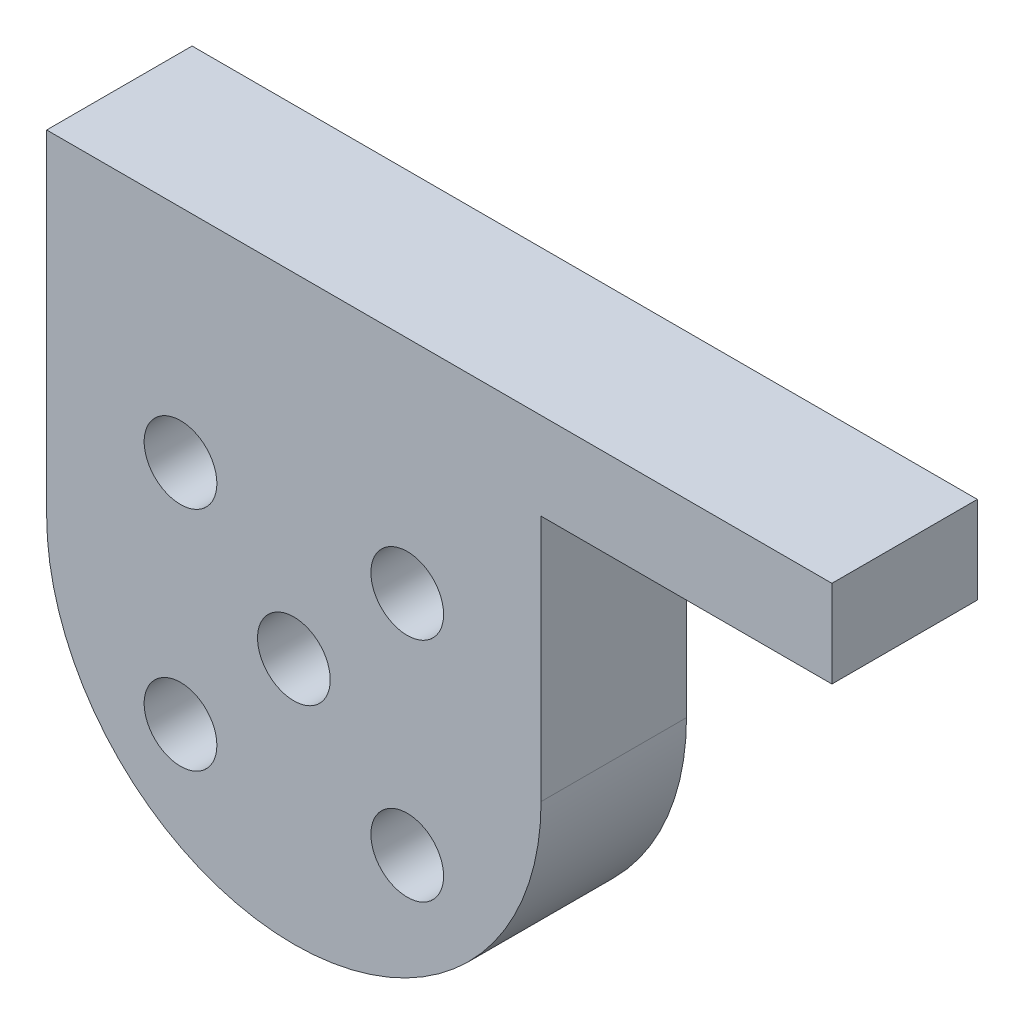
ISO-10303-21;
HEADER;
FILE_DESCRIPTION(('STEP AP214'),'2;1');
FILE_NAME('part.step','',(''),(''),'','','');
FILE_SCHEMA(('AUTOMOTIVE_DESIGN { 1 0 10303 214 1 1 1 1 }'));
ENDSEC;
DATA;
#1=APPLICATION_CONTEXT('core data for automotive mechanical design processes');
#2=APPLICATION_PROTOCOL_DEFINITION('international standard','automotive_design',2000,#1);
#3=PRODUCT_CONTEXT('',#1,'mechanical');
#4=PRODUCT('Part','Part','',(#3));
#5=PRODUCT_RELATED_PRODUCT_CATEGORY('part','',(#4));
#6=PRODUCT_DEFINITION_FORMATION('','',#4);
#7=PRODUCT_DEFINITION_CONTEXT('part definition',#1,'design');
#8=PRODUCT_DEFINITION('design','',#6,#7);
#9=PRODUCT_DEFINITION_SHAPE('','',#8);
#10=(LENGTH_UNIT() NAMED_UNIT(*) SI_UNIT(.MILLI.,.METRE.));
#11=(NAMED_UNIT(*) PLANE_ANGLE_UNIT() SI_UNIT($,.RADIAN.));
#12=(NAMED_UNIT(*) SI_UNIT($,.STERADIAN.) SOLID_ANGLE_UNIT());
#13=UNCERTAINTY_MEASURE_WITH_UNIT(LENGTH_MEASURE(1.E-05),#10,'distance_accuracy_value','');
#14=(GEOMETRIC_REPRESENTATION_CONTEXT(3) GLOBAL_UNCERTAINTY_ASSIGNED_CONTEXT((#13)) GLOBAL_UNIT_ASSIGNED_CONTEXT((#10,
#11,#12)) REPRESENTATION_CONTEXT('',''));
#15=CARTESIAN_POINT('',(0.,0.,0.));
#16=DIRECTION('',(0.,0.,1.));
#17=DIRECTION('',(1.,0.,0.));
#18=AXIS2_PLACEMENT_3D('',#15,#16,#17);
#19=CARTESIAN_POINT('',(0.,0.,6.35));
#20=DIRECTION('',(0.,0.,1.));
#21=DIRECTION('',(1.,0.,0.));
#22=AXIS2_PLACEMENT_3D('',#19,#20,#21);
#23=PLANE('',#22);
#24=CARTESIAN_POINT('',(4.95000000000002,-4.95,6.35));
#25=DIRECTION('',(0.,0.,1.));
#26=DIRECTION('',(1.,0.,0.));
#27=AXIS2_PLACEMENT_3D('',#24,#25,#26);
#28=CIRCLE('',#27,1.58749999999999);
#29=CARTESIAN_POINT('',(6.53750000000001,-4.95,6.35));
#30=VERTEX_POINT('',#29);
#31=EDGE_CURVE('E220',#30,#30,#28,.T.);
#32=ORIENTED_EDGE('',*,*,#31,.F.);
#33=EDGE_LOOP('',(#32));
#34=FACE_BOUND('',#33,.T.);
#35=CARTESIAN_POINT('',(-4.94999999999998,4.95000000000002,6.35));
#36=DIRECTION('',(0.,0.,1.));
#37=DIRECTION('',(1.,0.,0.));
#38=AXIS2_PLACEMENT_3D('',#35,#36,#37);
#39=CIRCLE('',#38,1.5875);
#40=CARTESIAN_POINT('',(-3.36249999999998,4.95000000000002,6.35));
#41=VERTEX_POINT('',#40);
#42=EDGE_CURVE('E236',#41,#41,#39,.T.);
#43=ORIENTED_EDGE('',*,*,#42,.F.);
#44=EDGE_LOOP('',(#43));
#45=FACE_BOUND('',#44,.T.);
#46=CARTESIAN_POINT('',(0.,0.,6.35));
#47=DIRECTION('',(0.,0.,1.));
#48=DIRECTION('',(1.,0.,0.));
#49=AXIS2_PLACEMENT_3D('',#46,#47,#48);
#50=CIRCLE('',#49,10.795);
#51=CARTESIAN_POINT('',(-10.795,0.,6.35));
#52=VERTEX_POINT('',#51);
#53=CARTESIAN_POINT('',(10.795,0.,6.35));
#54=VERTEX_POINT('',#53);
#55=EDGE_CURVE('E150',#52,#54,#50,.T.);
#56=ORIENTED_EDGE('',*,*,#55,.T.);
#57=DIRECTION('',(0.,1.,0.));
#58=VECTOR('',#57,1.);
#59=CARTESIAN_POINT('',(10.795,0.,6.35));
#60=LINE('',#59,#58);
#61=CARTESIAN_POINT('',(10.795,10.795,6.35));
#62=VERTEX_POINT('',#61);
#63=EDGE_CURVE('E98',#54,#62,#60,.T.);
#64=ORIENTED_EDGE('',*,*,#63,.T.);
#65=DIRECTION('',(1.,0.,0.));
#66=VECTOR('',#65,1.);
#67=CARTESIAN_POINT('',(10.795,10.795,6.35));
#68=LINE('',#67,#66);
#69=CARTESIAN_POINT('',(23.495,10.795,6.35));
#70=VERTEX_POINT('',#69);
#71=EDGE_CURVE('E111',#62,#70,#68,.T.);
#72=ORIENTED_EDGE('',*,*,#71,.T.);
#73=DIRECTION('',(0.,1.,0.));
#74=VECTOR('',#73,1.);
#75=CARTESIAN_POINT('',(23.495,10.795,6.35));
#76=LINE('',#75,#74);
#77=CARTESIAN_POINT('',(23.495,14.605,6.35));
#78=VERTEX_POINT('',#77);
#79=EDGE_CURVE('E105',#70,#78,#76,.T.);
#80=ORIENTED_EDGE('',*,*,#79,.T.);
#81=DIRECTION('',(-1.,0.,0.));
#82=VECTOR('',#81,1.);
#83=CARTESIAN_POINT('',(23.495,14.605,6.35));
#84=LINE('',#83,#82);
#85=CARTESIAN_POINT('',(-10.795,14.605,6.35));
#86=VERTEX_POINT('',#85);
#87=EDGE_CURVE('E109',#78,#86,#84,.T.);
#88=ORIENTED_EDGE('',*,*,#87,.T.);
#89=DIRECTION('',(0.,-1.,0.));
#90=VECTOR('',#89,1.);
#91=CARTESIAN_POINT('',(-10.795,14.605,6.35));
#92=LINE('',#91,#90);
#93=EDGE_CURVE('E61',#86,#52,#92,.T.);
#94=ORIENTED_EDGE('',*,*,#93,.T.);
#95=EDGE_LOOP('',(#56,#64,#72,#80,#88,#94));
#96=FACE_BOUND('',#95,.T.);
#97=CARTESIAN_POINT('',(0.,0.,6.35));
#98=DIRECTION('',(0.,0.,1.));
#99=DIRECTION('',(1.,0.,0.));
#100=AXIS2_PLACEMENT_3D('',#97,#98,#99);
#101=CIRCLE('',#100,1.5875);
#102=CARTESIAN_POINT('',(1.58750000000006,0.,6.35));
#103=VERTEX_POINT('',#102);
#104=EDGE_CURVE('E138',#103,#103,#101,.T.);
#105=ORIENTED_EDGE('',*,*,#104,.F.);
#106=EDGE_LOOP('',(#105));
#107=FACE_BOUND('',#106,.T.);
#108=CARTESIAN_POINT('',(-4.94999999999998,-4.95,6.35));
#109=DIRECTION('',(0.,0.,1.));
#110=DIRECTION('',(1.,0.,0.));
#111=AXIS2_PLACEMENT_3D('',#108,#109,#110);
#112=CIRCLE('',#111,1.5875);
#113=CARTESIAN_POINT('',(-3.36249999999998,-4.95,6.35));
#114=VERTEX_POINT('',#113);
#115=EDGE_CURVE('E228',#114,#114,#112,.T.);
#116=ORIENTED_EDGE('',*,*,#115,.F.);
#117=EDGE_LOOP('',(#116));
#118=FACE_BOUND('',#117,.T.);
#119=CARTESIAN_POINT('',(4.95000000000002,4.95000000000002,6.35));
#120=DIRECTION('',(0.,0.,1.));
#121=DIRECTION('',(1.,0.,0.));
#122=AXIS2_PLACEMENT_3D('',#119,#120,#121);
#123=CIRCLE('',#122,1.58749999999999);
#124=CARTESIAN_POINT('',(6.53750000000001,4.95000000000002,6.35));
#125=VERTEX_POINT('',#124);
#126=EDGE_CURVE('E209',#125,#125,#123,.T.);
#127=ORIENTED_EDGE('',*,*,#126,.F.);
#128=EDGE_LOOP('',(#127));
#129=FACE_BOUND('',#128,.T.);
#130=ADVANCED_FACE('F43',(#34,#45,#96,#107,#118,#129),#23,.T.);
#131=CARTESIAN_POINT('',(0.,0.,0.));
#132=DIRECTION('',(0.,0.,1.));
#133=DIRECTION('',(1.,0.,0.));
#134=AXIS2_PLACEMENT_3D('',#131,#132,#133);
#135=PLANE('',#134);
#136=CARTESIAN_POINT('',(0.,0.,0.));
#137=DIRECTION('',(0.,0.,1.));
#138=DIRECTION('',(1.,0.,0.));
#139=AXIS2_PLACEMENT_3D('',#136,#137,#138);
#140=CIRCLE('',#139,10.795);
#141=CARTESIAN_POINT('',(-10.795,0.,0.));
#142=VERTEX_POINT('',#141);
#143=CARTESIAN_POINT('',(10.795,0.,0.));
#144=VERTEX_POINT('',#143);
#145=EDGE_CURVE('E133',#142,#144,#140,.T.);
#146=ORIENTED_EDGE('',*,*,#145,.F.);
#147=DIRECTION('',(0.,-1.,0.));
#148=VECTOR('',#147,1.);
#149=CARTESIAN_POINT('',(-10.795,14.605,0.));
#150=LINE('',#149,#148);
#151=CARTESIAN_POINT('',(-10.795,14.605,0.));
#152=VERTEX_POINT('',#151);
#153=EDGE_CURVE('E90',#152,#142,#150,.T.);
#154=ORIENTED_EDGE('',*,*,#153,.F.);
#155=DIRECTION('',(-1.,0.,0.));
#156=VECTOR('',#155,1.);
#157=CARTESIAN_POINT('',(23.495,14.605,0.));
#158=LINE('',#157,#156);
#159=CARTESIAN_POINT('',(23.495,14.605,0.));
#160=VERTEX_POINT('',#159);
#161=EDGE_CURVE('E84',#160,#152,#158,.T.);
#162=ORIENTED_EDGE('',*,*,#161,.F.);
#163=DIRECTION('',(0.,1.,0.));
#164=VECTOR('',#163,1.);
#165=CARTESIAN_POINT('',(23.495,10.795,0.));
#166=LINE('',#165,#164);
#167=CARTESIAN_POINT('',(23.495,10.795,0.));
#168=VERTEX_POINT('',#167);
#169=EDGE_CURVE('E120',#168,#160,#166,.T.);
#170=ORIENTED_EDGE('',*,*,#169,.F.);
#171=DIRECTION('',(1.,0.,0.));
#172=VECTOR('',#171,1.);
#173=CARTESIAN_POINT('',(10.795,10.795,0.));
#174=LINE('',#173,#172);
#175=CARTESIAN_POINT('',(10.795,10.795,0.));
#176=VERTEX_POINT('',#175);
#177=EDGE_CURVE('E141',#176,#168,#174,.T.);
#178=ORIENTED_EDGE('',*,*,#177,.F.);
#179=DIRECTION('',(0.,1.,0.));
#180=VECTOR('',#179,1.);
#181=CARTESIAN_POINT('',(10.795,0.,0.));
#182=LINE('',#181,#180);
#183=EDGE_CURVE('E137',#144,#176,#182,.T.);
#184=ORIENTED_EDGE('',*,*,#183,.F.);
#185=EDGE_LOOP('',(#146,#154,#162,#170,#178,#184));
#186=FACE_BOUND('',#185,.T.);
#187=CARTESIAN_POINT('',(0.,0.,0.));
#188=DIRECTION('',(0.,0.,1.));
#189=DIRECTION('',(1.,0.,0.));
#190=AXIS2_PLACEMENT_3D('',#187,#188,#189);
#191=CIRCLE('',#190,1.5875);
#192=CARTESIAN_POINT('',(1.58750000000006,0.,0.));
#193=VERTEX_POINT('',#192);
#194=EDGE_CURVE('E240',#193,#193,#191,.T.);
#195=ORIENTED_EDGE('',*,*,#194,.T.);
#196=EDGE_LOOP('',(#195));
#197=FACE_BOUND('',#196,.T.);
#198=CARTESIAN_POINT('',(-4.94999999999998,4.95000000000002,0.));
#199=DIRECTION('',(0.,0.,1.));
#200=DIRECTION('',(1.,0.,0.));
#201=AXIS2_PLACEMENT_3D('',#198,#199,#200);
#202=CIRCLE('',#201,1.5875);
#203=CARTESIAN_POINT('',(-3.36249999999998,4.95000000000002,0.));
#204=VERTEX_POINT('',#203);
#205=EDGE_CURVE('E232',#204,#204,#202,.T.);
#206=ORIENTED_EDGE('',*,*,#205,.T.);
#207=EDGE_LOOP('',(#206));
#208=FACE_BOUND('',#207,.T.);
#209=CARTESIAN_POINT('',(-4.94999999999998,-4.95,0.));
#210=DIRECTION('',(0.,0.,1.));
#211=DIRECTION('',(1.,0.,0.));
#212=AXIS2_PLACEMENT_3D('',#209,#210,#211);
#213=CIRCLE('',#212,1.5875);
#214=CARTESIAN_POINT('',(-3.36249999999998,-4.95,0.));
#215=VERTEX_POINT('',#214);
#216=EDGE_CURVE('E224',#215,#215,#213,.T.);
#217=ORIENTED_EDGE('',*,*,#216,.T.);
#218=EDGE_LOOP('',(#217));
#219=FACE_BOUND('',#218,.T.);
#220=CARTESIAN_POINT('',(4.95000000000002,-4.95,0.));
#221=DIRECTION('',(0.,0.,1.));
#222=DIRECTION('',(1.,0.,0.));
#223=AXIS2_PLACEMENT_3D('',#220,#221,#222);
#224=CIRCLE('',#223,1.58749999999999);
#225=CARTESIAN_POINT('',(6.53750000000001,-4.95,0.));
#226=VERTEX_POINT('',#225);
#227=EDGE_CURVE('E217',#226,#226,#224,.T.);
#228=ORIENTED_EDGE('',*,*,#227,.T.);
#229=EDGE_LOOP('',(#228));
#230=FACE_BOUND('',#229,.T.);
#231=CARTESIAN_POINT('',(4.95000000000002,4.95000000000002,0.));
#232=DIRECTION('',(0.,0.,1.));
#233=DIRECTION('',(1.,0.,0.));
#234=AXIS2_PLACEMENT_3D('',#231,#232,#233);
#235=CIRCLE('',#234,1.58749999999999);
#236=CARTESIAN_POINT('',(6.53750000000001,4.95000000000002,0.));
#237=VERTEX_POINT('',#236);
#238=EDGE_CURVE('E212',#237,#237,#235,.T.);
#239=ORIENTED_EDGE('',*,*,#238,.T.);
#240=EDGE_LOOP('',(#239));
#241=FACE_BOUND('',#240,.T.);
#242=ADVANCED_FACE('F163',(#186,#197,#208,#219,#230,#241),#135,.F.);
#243=CARTESIAN_POINT('',(0.,0.,6.35));
#244=DIRECTION('',(0.,0.,-1.));
#245=DIRECTION('',(-1.,0.,0.));
#246=AXIS2_PLACEMENT_3D('',#243,#244,#245);
#247=CYLINDRICAL_SURFACE('',#246,10.795);
#248=ORIENTED_EDGE('',*,*,#145,.T.);
#249=DIRECTION('',(0.,0.,-1.));
#250=VECTOR('',#249,1.);
#251=CARTESIAN_POINT('',(10.795,0.,6.35));
#252=LINE('',#251,#250);
#253=EDGE_CURVE('E11',#54,#144,#252,.T.);
#254=ORIENTED_EDGE('',*,*,#253,.F.);
#255=ORIENTED_EDGE('',*,*,#55,.F.);
#256=DIRECTION('',(0.,0.,-1.));
#257=VECTOR('',#256,1.);
#258=CARTESIAN_POINT('',(-10.795,0.,6.35));
#259=LINE('',#258,#257);
#260=EDGE_CURVE('E129',#52,#142,#259,.T.);
#261=ORIENTED_EDGE('',*,*,#260,.T.);
#262=EDGE_LOOP('',(#248,#254,#255,#261));
#263=FACE_BOUND('',#262,.T.);
#264=ADVANCED_FACE('F45',(#263),#247,.T.);
#265=CARTESIAN_POINT('',(10.795,0.,6.35));
#266=DIRECTION('',(-1.,0.,0.));
#267=DIRECTION('',(0.,0.,1.));
#268=AXIS2_PLACEMENT_3D('',#265,#266,#267);
#269=PLANE('',#268);
#270=ORIENTED_EDGE('',*,*,#183,.T.);
#271=DIRECTION('',(0.,0.,-1.));
#272=VECTOR('',#271,1.);
#273=CARTESIAN_POINT('',(10.795,10.795,6.35));
#274=LINE('',#273,#272);
#275=EDGE_CURVE('E53',#62,#176,#274,.T.);
#276=ORIENTED_EDGE('',*,*,#275,.F.);
#277=ORIENTED_EDGE('',*,*,#63,.F.);
#278=ORIENTED_EDGE('',*,*,#253,.T.);
#279=EDGE_LOOP('',(#270,#276,#277,#278));
#280=FACE_BOUND('',#279,.T.);
#281=ADVANCED_FACE('F317',(#280),#269,.F.);
#282=CARTESIAN_POINT('',(10.795,10.795,6.35));
#283=DIRECTION('',(0.,1.,0.));
#284=DIRECTION('',(0.,0.,1.));
#285=AXIS2_PLACEMENT_3D('',#282,#283,#284);
#286=PLANE('',#285);
#287=ORIENTED_EDGE('',*,*,#177,.T.);
#288=DIRECTION('',(0.,0.,-1.));
#289=VECTOR('',#288,1.);
#290=CARTESIAN_POINT('',(23.495,10.795,6.35));
#291=LINE('',#290,#289);
#292=EDGE_CURVE('E122',#70,#168,#291,.T.);
#293=ORIENTED_EDGE('',*,*,#292,.F.);
#294=ORIENTED_EDGE('',*,*,#71,.F.);
#295=ORIENTED_EDGE('',*,*,#275,.T.);
#296=EDGE_LOOP('',(#287,#293,#294,#295));
#297=FACE_BOUND('',#296,.T.);
#298=ADVANCED_FACE('F160',(#297),#286,.F.);
#299=CARTESIAN_POINT('',(23.495,10.795,6.35));
#300=DIRECTION('',(-1.,0.,0.));
#301=DIRECTION('',(0.,0.,1.));
#302=AXIS2_PLACEMENT_3D('',#299,#300,#301);
#303=PLANE('',#302);
#304=ORIENTED_EDGE('',*,*,#169,.T.);
#305=DIRECTION('',(0.,0.,-1.));
#306=VECTOR('',#305,1.);
#307=CARTESIAN_POINT('',(23.495,14.605,6.35));
#308=LINE('',#307,#306);
#309=EDGE_CURVE('E117',#78,#160,#308,.T.);
#310=ORIENTED_EDGE('',*,*,#309,.F.);
#311=ORIENTED_EDGE('',*,*,#79,.F.);
#312=ORIENTED_EDGE('',*,*,#292,.T.);
#313=EDGE_LOOP('',(#304,#310,#311,#312));
#314=FACE_BOUND('',#313,.T.);
#315=ADVANCED_FACE('F118',(#314),#303,.F.);
#316=CARTESIAN_POINT('',(23.495,14.605,6.35));
#317=DIRECTION('',(0.,-1.,0.));
#318=DIRECTION('',(1.,0.,0.));
#319=AXIS2_PLACEMENT_3D('',#316,#317,#318);
#320=PLANE('',#319);
#321=ORIENTED_EDGE('',*,*,#161,.T.);
#322=DIRECTION('',(0.,0.,-1.));
#323=VECTOR('',#322,1.);
#324=CARTESIAN_POINT('',(-10.795,14.605,6.35));
#325=LINE('',#324,#323);
#326=EDGE_CURVE('E123',#86,#152,#325,.T.);
#327=ORIENTED_EDGE('',*,*,#326,.F.);
#328=ORIENTED_EDGE('',*,*,#87,.F.);
#329=ORIENTED_EDGE('',*,*,#309,.T.);
#330=EDGE_LOOP('',(#321,#327,#328,#329));
#331=FACE_BOUND('',#330,.T.);
#332=ADVANCED_FACE('F125',(#331),#320,.F.);
#333=CARTESIAN_POINT('',(-10.795,14.605,6.35));
#334=DIRECTION('',(1.,0.,0.));
#335=DIRECTION('',(0.,0.,-1.));
#336=AXIS2_PLACEMENT_3D('',#333,#334,#335);
#337=PLANE('',#336);
#338=ORIENTED_EDGE('',*,*,#153,.T.);
#339=ORIENTED_EDGE('',*,*,#260,.F.);
#340=ORIENTED_EDGE('',*,*,#93,.F.);
#341=ORIENTED_EDGE('',*,*,#326,.T.);
#342=EDGE_LOOP('',(#338,#339,#340,#341));
#343=FACE_BOUND('',#342,.T.);
#344=ADVANCED_FACE('F168',(#343),#337,.F.);
#345=CARTESIAN_POINT('',(0.,0.,6.35));
#346=DIRECTION('',(0.,0.,-1.));
#347=DIRECTION('',(-1.,0.,0.));
#348=AXIS2_PLACEMENT_3D('',#345,#346,#347);
#349=CYLINDRICAL_SURFACE('',#348,1.5875);
#350=ORIENTED_EDGE('',*,*,#104,.T.);
#351=EDGE_LOOP('',(#350));
#352=FACE_BOUND('',#351,.T.);
#353=ORIENTED_EDGE('',*,*,#194,.F.);
#354=EDGE_LOOP('',(#353));
#355=FACE_BOUND('',#354,.T.);
#356=ADVANCED_FACE('F170',(#352,#355),#349,.F.);
#357=CARTESIAN_POINT('',(-4.94999999999998,4.95000000000002,6.35));
#358=DIRECTION('',(0.,0.,-1.));
#359=DIRECTION('',(-1.,0.,0.));
#360=AXIS2_PLACEMENT_3D('',#357,#358,#359);
#361=CYLINDRICAL_SURFACE('',#360,1.5875);
#362=ORIENTED_EDGE('',*,*,#42,.T.);
#363=EDGE_LOOP('',(#362));
#364=FACE_BOUND('',#363,.T.);
#365=ORIENTED_EDGE('',*,*,#205,.F.);
#366=EDGE_LOOP('',(#365));
#367=FACE_BOUND('',#366,.T.);
#368=ADVANCED_FACE('F176',(#364,#367),#361,.F.);
#369=CARTESIAN_POINT('',(-4.94999999999998,-4.95,6.35));
#370=DIRECTION('',(0.,0.,-1.));
#371=DIRECTION('',(-1.,0.,0.));
#372=AXIS2_PLACEMENT_3D('',#369,#370,#371);
#373=CYLINDRICAL_SURFACE('',#372,1.5875);
#374=ORIENTED_EDGE('',*,*,#115,.T.);
#375=EDGE_LOOP('',(#374));
#376=FACE_BOUND('',#375,.T.);
#377=ORIENTED_EDGE('',*,*,#216,.F.);
#378=EDGE_LOOP('',(#377));
#379=FACE_BOUND('',#378,.T.);
#380=ADVANCED_FACE('F192',(#376,#379),#373,.F.);
#381=CARTESIAN_POINT('',(4.95000000000002,-4.95,6.35));
#382=DIRECTION('',(0.,0.,-1.));
#383=DIRECTION('',(-1.,0.,0.));
#384=AXIS2_PLACEMENT_3D('',#381,#382,#383);
#385=CYLINDRICAL_SURFACE('',#384,1.58749999999999);
#386=ORIENTED_EDGE('',*,*,#31,.T.);
#387=EDGE_LOOP('',(#386));
#388=FACE_BOUND('',#387,.T.);
#389=ORIENTED_EDGE('',*,*,#227,.F.);
#390=EDGE_LOOP('',(#389));
#391=FACE_BOUND('',#390,.T.);
#392=ADVANCED_FACE('F196',(#388,#391),#385,.F.);
#393=CARTESIAN_POINT('',(4.95000000000002,4.95000000000002,6.35));
#394=DIRECTION('',(0.,0.,-1.));
#395=DIRECTION('',(-1.,0.,0.));
#396=AXIS2_PLACEMENT_3D('',#393,#394,#395);
#397=CYLINDRICAL_SURFACE('',#396,1.58749999999999);
#398=ORIENTED_EDGE('',*,*,#126,.T.);
#399=EDGE_LOOP('',(#398));
#400=FACE_BOUND('',#399,.T.);
#401=ORIENTED_EDGE('',*,*,#238,.F.);
#402=EDGE_LOOP('',(#401));
#403=FACE_BOUND('',#402,.T.);
#404=ADVANCED_FACE('F200',(#400,#403),#397,.F.);
#405=CLOSED_SHELL('',(#130,#242,#264,#281,#298,#315,#332,#344,#356,#368,#380,#392,#404));
#406=MANIFOLD_SOLID_BREP('B2',#405);
#407=ADVANCED_BREP_SHAPE_REPRESENTATION('',(#18,#406),#14);
#408=SHAPE_DEFINITION_REPRESENTATION(#9,#407);
ENDSEC;
END-ISO-10303-21;
